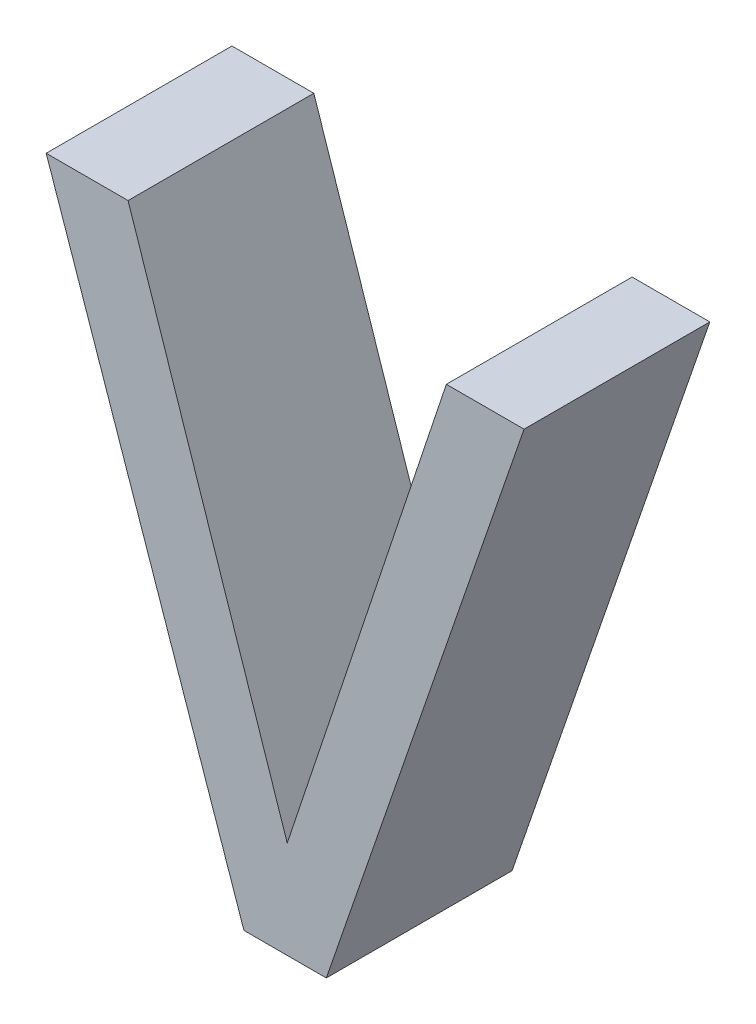
ISO-10303-21;
HEADER;
FILE_DESCRIPTION(('STEP AP214'),'2;1');
FILE_NAME('part.step','',(''),(''),'','','');
FILE_SCHEMA(('AUTOMOTIVE_DESIGN { 1 0 10303 214 1 1 1 1 }'));
ENDSEC;
DATA;
#1=APPLICATION_CONTEXT('core data for automotive mechanical design processes');
#2=APPLICATION_PROTOCOL_DEFINITION('international standard','automotive_design',2000,#1);
#3=PRODUCT_CONTEXT('',#1,'mechanical');
#4=PRODUCT('Part','Part','',(#3));
#5=PRODUCT_RELATED_PRODUCT_CATEGORY('part','',(#4));
#6=PRODUCT_DEFINITION_FORMATION('','',#4);
#7=PRODUCT_DEFINITION_CONTEXT('part definition',#1,'design');
#8=PRODUCT_DEFINITION('design','',#6,#7);
#9=PRODUCT_DEFINITION_SHAPE('','',#8);
#10=(LENGTH_UNIT() NAMED_UNIT(*) SI_UNIT(.MILLI.,.METRE.));
#11=(NAMED_UNIT(*) PLANE_ANGLE_UNIT() SI_UNIT($,.RADIAN.));
#12=(NAMED_UNIT(*) SI_UNIT($,.STERADIAN.) SOLID_ANGLE_UNIT());
#13=UNCERTAINTY_MEASURE_WITH_UNIT(LENGTH_MEASURE(1.E-05),#10,'distance_accuracy_value','');
#14=(GEOMETRIC_REPRESENTATION_CONTEXT(3) GLOBAL_UNCERTAINTY_ASSIGNED_CONTEXT((#13)) GLOBAL_UNIT_ASSIGNED_CONTEXT((#10,
#11,#12)) REPRESENTATION_CONTEXT('',''));
#15=CARTESIAN_POINT('',(0.,0.,0.));
#16=DIRECTION('',(0.,0.,1.));
#17=DIRECTION('',(1.,0.,0.));
#18=AXIS2_PLACEMENT_3D('',#15,#16,#17);
#19=CARTESIAN_POINT('',(-1.183194011929,-2.941706644287,0.));
#20=DIRECTION('',(0.,-1.,0.));
#21=DIRECTION('',(1.,0.,0.));
#22=AXIS2_PLACEMENT_3D('',#19,#20,#21);
#23=PLANE('',#22);
#24=DIRECTION('',(-1.,0.,0.));
#25=VECTOR('',#24,1.);
#26=CARTESIAN_POINT('',(-1.13885748517,-2.941706644287,0.));
#27=LINE('',#26,#25);
#28=CARTESIAN_POINT('',(-1.13885748517,-2.941706644287,0.));
#29=VERTEX_POINT('',#28);
#30=CARTESIAN_POINT('',(-1.183194011929,-2.941706644287,0.));
#31=VERTEX_POINT('',#30);
#32=EDGE_CURVE('E11',#29,#31,#27,.T.);
#33=ORIENTED_EDGE('',*,*,#32,.F.);
#34=DIRECTION('',(0.,0.,1.));
#35=VECTOR('',#34,1.);
#36=CARTESIAN_POINT('',(-1.13885748517,-2.941706644287,0.));
#37=LINE('',#36,#35);
#38=CARTESIAN_POINT('',(-1.13885748517,-2.941706644287,0.1));
#39=VERTEX_POINT('',#38);
#40=EDGE_CURVE('E24',#29,#39,#37,.T.);
#41=ORIENTED_EDGE('',*,*,#40,.T.);
#42=DIRECTION('',(1.,0.,0.));
#43=VECTOR('',#42,1.);
#44=CARTESIAN_POINT('',(-1.13885748517,-2.941706644287,0.1));
#45=LINE('',#44,#43);
#46=CARTESIAN_POINT('',(-1.183194011929,-2.941706644287,0.1));
#47=VERTEX_POINT('',#46);
#48=EDGE_CURVE('E94',#47,#39,#45,.T.);
#49=ORIENTED_EDGE('',*,*,#48,.F.);
#50=DIRECTION('',(0.,0.,1.));
#51=VECTOR('',#50,1.);
#52=CARTESIAN_POINT('',(-1.183194011929,-2.941706644287,0.));
#53=LINE('',#52,#51);
#54=EDGE_CURVE('E127',#31,#47,#53,.T.);
#55=ORIENTED_EDGE('',*,*,#54,.F.);
#56=EDGE_LOOP('',(#33,#41,#49,#55));
#57=FACE_BOUND('',#56,.T.);
#58=ADVANCED_FACE('F17',(#57),#23,.T.);
#59=CARTESIAN_POINT('',(-1.28965177392,-2.632603401234,0.));
#60=DIRECTION('',(-0.945495051848977,-0.325636464372621,0.));
#61=DIRECTION('',(0.325636464372621,-0.945495051848977,0.));
#62=AXIS2_PLACEMENT_3D('',#59,#60,#61);
#63=PLANE('',#62);
#64=DIRECTION('',(-0.325636464372621,0.945495051848976,0.));
#65=VECTOR('',#64,1.);
#66=CARTESIAN_POINT('',(-1.183194011929,-2.941706644287,0.));
#67=LINE('',#66,#65);
#68=CARTESIAN_POINT('',(-1.28965177392,-2.632603401234,0.));
#69=VERTEX_POINT('',#68);
#70=EDGE_CURVE('E125',#31,#69,#67,.T.);
#71=ORIENTED_EDGE('',*,*,#70,.F.);
#72=ORIENTED_EDGE('',*,*,#54,.T.);
#73=DIRECTION('',(0.325636464372621,-0.945495051848976,0.));
#74=VECTOR('',#73,1.);
#75=CARTESIAN_POINT('',(-1.183194011929,-2.941706644287,0.1));
#76=LINE('',#75,#74);
#77=CARTESIAN_POINT('',(-1.28965177392,-2.632603401234,0.1));
#78=VERTEX_POINT('',#77);
#79=EDGE_CURVE('E123',#78,#47,#76,.T.);
#80=ORIENTED_EDGE('',*,*,#79,.F.);
#81=DIRECTION('',(0.,0.,1.));
#82=VECTOR('',#81,1.);
#83=CARTESIAN_POINT('',(-1.28965177392,-2.632603401234,0.));
#84=LINE('',#83,#82);
#85=EDGE_CURVE('E120',#69,#78,#84,.T.);
#86=ORIENTED_EDGE('',*,*,#85,.F.);
#87=EDGE_LOOP('',(#71,#72,#80,#86));
#88=FACE_BOUND('',#87,.T.);
#89=ADVANCED_FACE('F145',(#88),#63,.T.);
#90=CARTESIAN_POINT('',(-1.245565736013,-2.632603401234,0.));
#91=DIRECTION('',(0.,1.,0.));
#92=DIRECTION('',(-1.,0.,0.));
#93=AXIS2_PLACEMENT_3D('',#90,#91,#92);
#94=PLANE('',#93);
#95=DIRECTION('',(1.,0.,0.));
#96=VECTOR('',#95,1.);
#97=CARTESIAN_POINT('',(-1.28965177392,-2.632603401234,0.));
#98=LINE('',#97,#96);
#99=CARTESIAN_POINT('',(-1.245565736013,-2.632603401234,0.));
#100=VERTEX_POINT('',#99);
#101=EDGE_CURVE('E118',#69,#100,#98,.T.);
#102=ORIENTED_EDGE('',*,*,#101,.F.);
#103=ORIENTED_EDGE('',*,*,#85,.T.);
#104=DIRECTION('',(-1.,0.,0.));
#105=VECTOR('',#104,1.);
#106=CARTESIAN_POINT('',(-1.28965177392,-2.632603401234,0.1));
#107=LINE('',#106,#105);
#108=CARTESIAN_POINT('',(-1.245565736013,-2.632603401234,0.1));
#109=VERTEX_POINT('',#108);
#110=EDGE_CURVE('E115',#109,#78,#107,.T.);
#111=ORIENTED_EDGE('',*,*,#110,.F.);
#112=DIRECTION('',(0.,0.,1.));
#113=VECTOR('',#112,1.);
#114=CARTESIAN_POINT('',(-1.245565736013,-2.632603401234,0.));
#115=LINE('',#114,#113);
#116=EDGE_CURVE('E112',#100,#109,#115,.T.);
#117=ORIENTED_EDGE('',*,*,#116,.F.);
#118=EDGE_LOOP('',(#102,#103,#111,#117));
#119=FACE_BOUND('',#118,.T.);
#120=ADVANCED_FACE('F141',(#119),#94,.T.);
#121=CARTESIAN_POINT('',(-1.159898548717,-2.889354474273,0.));
#122=DIRECTION('',(0.948590711989459,0.316505388780873,0.));
#123=DIRECTION('',(-0.316505388780873,0.948590711989459,0.));
#124=AXIS2_PLACEMENT_3D('',#121,#122,#123);
#125=PLANE('',#124);
#126=DIRECTION('',(0.316505388780873,-0.948590711989459,0.));
#127=VECTOR('',#126,1.);
#128=CARTESIAN_POINT('',(-1.245565736013,-2.632603401234,0.));
#129=LINE('',#128,#127);
#130=CARTESIAN_POINT('',(-1.159898548717,-2.889354474273,0.));
#131=VERTEX_POINT('',#130);
#132=EDGE_CURVE('E110',#100,#131,#129,.T.);
#133=ORIENTED_EDGE('',*,*,#132,.F.);
#134=ORIENTED_EDGE('',*,*,#116,.T.);
#135=DIRECTION('',(-0.316505388780873,0.948590711989459,0.));
#136=VECTOR('',#135,1.);
#137=CARTESIAN_POINT('',(-1.245565736013,-2.632603401234,0.1));
#138=LINE('',#137,#136);
#139=CARTESIAN_POINT('',(-1.159898548717,-2.889354474273,0.1));
#140=VERTEX_POINT('',#139);
#141=EDGE_CURVE('E107',#140,#109,#138,.T.);
#142=ORIENTED_EDGE('',*,*,#141,.F.);
#143=DIRECTION('',(0.,0.,1.));
#144=VECTOR('',#143,1.);
#145=CARTESIAN_POINT('',(-1.159898548717,-2.889354474273,0.));
#146=LINE('',#145,#144);
#147=EDGE_CURVE('E104',#131,#140,#146,.T.);
#148=ORIENTED_EDGE('',*,*,#147,.F.);
#149=EDGE_LOOP('',(#133,#134,#142,#148));
#150=FACE_BOUND('',#149,.T.);
#151=ADVANCED_FACE('F137',(#150),#125,.T.);
#152=CARTESIAN_POINT('',(-1.07423136142,-2.632603401234,0.));
#153=DIRECTION('',(-0.948590711989459,0.316505388780873,0.));
#154=DIRECTION('',(-0.316505388780873,-0.948590711989459,0.));
#155=AXIS2_PLACEMENT_3D('',#152,#153,#154);
#156=PLANE('',#155);
#157=DIRECTION('',(0.316505388780873,0.948590711989459,0.));
#158=VECTOR('',#157,1.);
#159=CARTESIAN_POINT('',(-1.159898548717,-2.889354474273,0.));
#160=LINE('',#159,#158);
#161=CARTESIAN_POINT('',(-1.07423136142,-2.632603401234,0.));
#162=VERTEX_POINT('',#161);
#163=EDGE_CURVE('E102',#131,#162,#160,.T.);
#164=ORIENTED_EDGE('',*,*,#163,.F.);
#165=ORIENTED_EDGE('',*,*,#147,.T.);
#166=DIRECTION('',(-0.316505388780873,-0.948590711989459,0.));
#167=VECTOR('',#166,1.);
#168=CARTESIAN_POINT('',(-1.159898548717,-2.889354474273,0.1));
#169=LINE('',#168,#167);
#170=CARTESIAN_POINT('',(-1.07423136142,-2.632603401234,0.1));
#171=VERTEX_POINT('',#170);
#172=EDGE_CURVE('E100',#171,#140,#169,.T.);
#173=ORIENTED_EDGE('',*,*,#172,.F.);
#174=DIRECTION('',(0.,0.,1.));
#175=VECTOR('',#174,1.);
#176=CARTESIAN_POINT('',(-1.07423136142,-2.632603401234,0.));
#177=LINE('',#176,#175);
#178=EDGE_CURVE('E79',#162,#171,#177,.T.);
#179=ORIENTED_EDGE('',*,*,#178,.F.);
#180=EDGE_LOOP('',(#164,#165,#173,#179));
#181=FACE_BOUND('',#180,.T.);
#182=ADVANCED_FACE('F135',(#181),#156,.T.);
#183=CARTESIAN_POINT('',(-1.032399723179,-2.632603401234,0.));
#184=DIRECTION('',(0.,1.,0.));
#185=DIRECTION('',(-1.,0.,0.));
#186=AXIS2_PLACEMENT_3D('',#183,#184,#185);
#187=PLANE('',#186);
#188=DIRECTION('',(1.,0.,0.));
#189=VECTOR('',#188,1.);
#190=CARTESIAN_POINT('',(-1.07423136142,-2.632603401234,0.));
#191=LINE('',#190,#189);
#192=CARTESIAN_POINT('',(-1.032399723179,-2.632603401234,0.));
#193=VERTEX_POINT('',#192);
#194=EDGE_CURVE('E83',#162,#193,#191,.T.);
#195=ORIENTED_EDGE('',*,*,#194,.F.);
#196=ORIENTED_EDGE('',*,*,#178,.T.);
#197=DIRECTION('',(-1.,0.,0.));
#198=VECTOR('',#197,1.);
#199=CARTESIAN_POINT('',(-1.07423136142,-2.632603401234,0.1));
#200=LINE('',#199,#198);
#201=CARTESIAN_POINT('',(-1.032399723179,-2.632603401234,0.1));
#202=VERTEX_POINT('',#201);
#203=EDGE_CURVE('E72',#202,#171,#200,.T.);
#204=ORIENTED_EDGE('',*,*,#203,.F.);
#205=DIRECTION('',(0.,0.,1.));
#206=VECTOR('',#205,1.);
#207=CARTESIAN_POINT('',(-1.032399723179,-2.632603401234,0.));
#208=LINE('',#207,#206);
#209=EDGE_CURVE('E76',#193,#202,#208,.T.);
#210=ORIENTED_EDGE('',*,*,#209,.F.);
#211=EDGE_LOOP('',(#195,#196,#204,#210));
#212=FACE_BOUND('',#211,.T.);
#213=ADVANCED_FACE('F75',(#212),#187,.T.);
#214=CARTESIAN_POINT('',(-1.13885748517,-2.941706644287,0.));
#215=DIRECTION('',(0.945495051848976,-0.325636464372622,0.));
#216=DIRECTION('',(0.325636464372622,0.945495051848976,0.));
#217=AXIS2_PLACEMENT_3D('',#214,#215,#216);
#218=PLANE('',#217);
#219=DIRECTION('',(-0.325636464372622,-0.945495051848976,0.));
#220=VECTOR('',#219,1.);
#221=CARTESIAN_POINT('',(-1.032399723179,-2.632603401234,0.));
#222=LINE('',#221,#220);
#223=EDGE_CURVE('E89',#193,#29,#222,.T.);
#224=ORIENTED_EDGE('',*,*,#223,.F.);
#225=ORIENTED_EDGE('',*,*,#209,.T.);
#226=DIRECTION('',(0.325636464372622,0.945495051848976,0.));
#227=VECTOR('',#226,1.);
#228=CARTESIAN_POINT('',(-1.032399723179,-2.632603401234,0.1));
#229=LINE('',#228,#227);
#230=EDGE_CURVE('E88',#39,#202,#229,.T.);
#231=ORIENTED_EDGE('',*,*,#230,.F.);
#232=ORIENTED_EDGE('',*,*,#40,.F.);
#233=EDGE_LOOP('',(#224,#225,#231,#232));
#234=FACE_BOUND('',#233,.T.);
#235=ADVANCED_FACE('F87',(#234),#218,.T.);
#236=CARTESIAN_POINT('',(-1.160711087786,-2.771615631241,0.));
#237=DIRECTION('',(0.,0.,1.));
#238=DIRECTION('',(1.,0.,0.));
#239=AXIS2_PLACEMENT_3D('',#236,#237,#238);
#240=PLANE('',#239);
#241=ORIENTED_EDGE('',*,*,#223,.T.);
#242=ORIENTED_EDGE('',*,*,#32,.T.);
#243=ORIENTED_EDGE('',*,*,#70,.T.);
#244=ORIENTED_EDGE('',*,*,#101,.T.);
#245=ORIENTED_EDGE('',*,*,#132,.T.);
#246=ORIENTED_EDGE('',*,*,#163,.T.);
#247=ORIENTED_EDGE('',*,*,#194,.T.);
#248=EDGE_LOOP('',(#241,#242,#243,#244,#245,#246,#247));
#249=FACE_BOUND('',#248,.T.);
#250=ADVANCED_FACE('F130',(#249),#240,.F.);
#251=CARTESIAN_POINT('',(-1.160711087786,-2.771615631241,0.1));
#252=DIRECTION('',(0.,0.,1.));
#253=DIRECTION('',(1.,0.,0.));
#254=AXIS2_PLACEMENT_3D('',#251,#252,#253);
#255=PLANE('',#254);
#256=ORIENTED_EDGE('',*,*,#230,.T.);
#257=ORIENTED_EDGE('',*,*,#203,.T.);
#258=ORIENTED_EDGE('',*,*,#172,.T.);
#259=ORIENTED_EDGE('',*,*,#141,.T.);
#260=ORIENTED_EDGE('',*,*,#110,.T.);
#261=ORIENTED_EDGE('',*,*,#79,.T.);
#262=ORIENTED_EDGE('',*,*,#48,.T.);
#263=EDGE_LOOP('',(#256,#257,#258,#259,#260,#261,#262));
#264=FACE_BOUND('',#263,.T.);
#265=ADVANCED_FACE('F92',(#264),#255,.T.);
#266=CLOSED_SHELL('',(#58,#89,#120,#151,#182,#213,#235,#250,#265));
#267=MANIFOLD_SOLID_BREP('B1',#266);
#268=ADVANCED_BREP_SHAPE_REPRESENTATION('',(#18,#267),#14);
#269=SHAPE_DEFINITION_REPRESENTATION(#9,#268);
ENDSEC;
END-ISO-10303-21;
